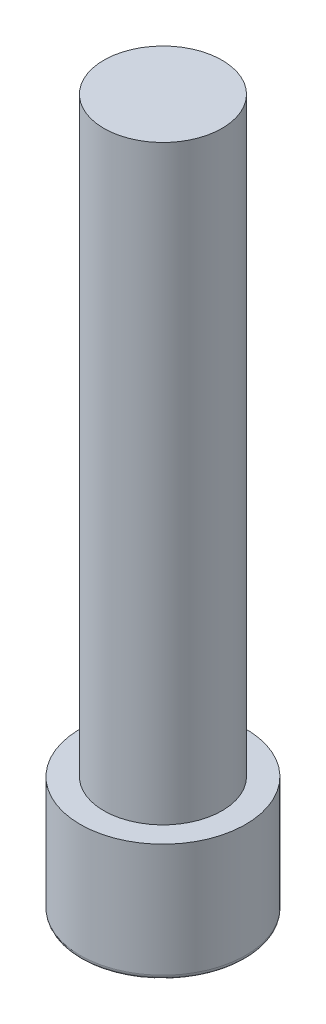
ISO-10303-21;
HEADER;
FILE_DESCRIPTION(('STEP AP214'),'2;1');
FILE_NAME('part.step','',(''),(''),'','','');
FILE_SCHEMA(('AUTOMOTIVE_DESIGN { 1 0 10303 214 1 1 1 1 }'));
ENDSEC;
DATA;
#1=APPLICATION_CONTEXT('core data for automotive mechanical design processes');
#2=APPLICATION_PROTOCOL_DEFINITION('international standard','automotive_design',2000,#1);
#3=PRODUCT_CONTEXT('',#1,'mechanical');
#4=PRODUCT('Part','Part','',(#3));
#5=PRODUCT_RELATED_PRODUCT_CATEGORY('part','',(#4));
#6=PRODUCT_DEFINITION_FORMATION('','',#4);
#7=PRODUCT_DEFINITION_CONTEXT('part definition',#1,'design');
#8=PRODUCT_DEFINITION('design','',#6,#7);
#9=PRODUCT_DEFINITION_SHAPE('','',#8);
#10=(LENGTH_UNIT() NAMED_UNIT(*) SI_UNIT(.MILLI.,.METRE.));
#11=(NAMED_UNIT(*) PLANE_ANGLE_UNIT() SI_UNIT($,.RADIAN.));
#12=(NAMED_UNIT(*) SI_UNIT($,.STERADIAN.) SOLID_ANGLE_UNIT());
#13=UNCERTAINTY_MEASURE_WITH_UNIT(LENGTH_MEASURE(1.E-05),#10,'distance_accuracy_value','');
#14=(GEOMETRIC_REPRESENTATION_CONTEXT(3) GLOBAL_UNCERTAINTY_ASSIGNED_CONTEXT((#13)) GLOBAL_UNIT_ASSIGNED_CONTEXT((#10,
#11,#12)) REPRESENTATION_CONTEXT('',''));
#15=CARTESIAN_POINT('',(0.,0.,0.));
#16=DIRECTION('',(0.,0.,1.));
#17=DIRECTION('',(1.,0.,0.));
#18=AXIS2_PLACEMENT_3D('',#15,#16,#17);
#19=CARTESIAN_POINT('',(0.,5.,0.));
#20=DIRECTION('',(0.,-1.,0.));
#21=DIRECTION('',(0.,0.,-1.));
#22=AXIS2_PLACEMENT_3D('',#19,#20,#21);
#23=CYLINDRICAL_SURFACE('',#22,3.5);
#24=CARTESIAN_POINT('',(0.,0.2,0.));
#25=DIRECTION('',(0.,1.,0.));
#26=DIRECTION('',(0.,0.,1.));
#27=AXIS2_PLACEMENT_3D('',#24,#25,#26);
#28=CIRCLE('',#27,3.5);
#29=CARTESIAN_POINT('',(0.,0.2,3.5));
#30=VERTEX_POINT('',#29);
#31=EDGE_CURVE('E50',#30,#30,#28,.T.);
#32=ORIENTED_EDGE('',*,*,#31,.T.);
#33=EDGE_LOOP('',(#32));
#34=FACE_BOUND('',#33,.T.);
#35=CARTESIAN_POINT('',(0.,5.,0.));
#36=DIRECTION('',(0.,1.,0.));
#37=DIRECTION('',(0.,0.,1.));
#38=AXIS2_PLACEMENT_3D('',#35,#36,#37);
#39=CIRCLE('',#38,3.5);
#40=CARTESIAN_POINT('',(0.,5.,3.5));
#41=VERTEX_POINT('',#40);
#42=EDGE_CURVE('E174',#41,#41,#39,.T.);
#43=ORIENTED_EDGE('',*,*,#42,.F.);
#44=EDGE_LOOP('',(#43));
#45=FACE_BOUND('',#44,.T.);
#46=ADVANCED_FACE('F41',(#34,#45),#23,.T.);
#47=CARTESIAN_POINT('',(0.,5.,0.));
#48=DIRECTION('',(0.,1.,0.));
#49=DIRECTION('',(0.,0.,1.));
#50=AXIS2_PLACEMENT_3D('',#47,#48,#49);
#51=PLANE('',#50);
#52=CARTESIAN_POINT('',(0.,5.,0.));
#53=DIRECTION('',(0.,1.,0.));
#54=DIRECTION('',(0.,0.,1.));
#55=AXIS2_PLACEMENT_3D('',#52,#53,#54);
#56=CIRCLE('',#55,2.5);
#57=CARTESIAN_POINT('',(0.,5.,2.5));
#58=VERTEX_POINT('',#57);
#59=EDGE_CURVE('E175',#58,#58,#56,.T.);
#60=ORIENTED_EDGE('',*,*,#59,.F.);
#61=EDGE_LOOP('',(#60));
#62=FACE_BOUND('',#61,.T.);
#63=ORIENTED_EDGE('',*,*,#42,.T.);
#64=EDGE_LOOP('',(#63));
#65=FACE_BOUND('',#64,.T.);
#66=ADVANCED_FACE('F251',(#62,#65),#51,.T.);
#67=CARTESIAN_POINT('',(0.,0.,0.));
#68=DIRECTION('',(0.,1.,0.));
#69=DIRECTION('',(0.,0.,1.));
#70=AXIS2_PLACEMENT_3D('',#67,#68,#69);
#71=PLANE('',#70);
#72=CARTESIAN_POINT('',(0.,0.,0.));
#73=DIRECTION('',(0.,1.,0.));
#74=DIRECTION('',(0.,0.,1.));
#75=AXIS2_PLACEMENT_3D('',#72,#73,#74);
#76=CIRCLE('',#75,3.3);
#77=CARTESIAN_POINT('',(0.,0.,3.3));
#78=VERTEX_POINT('',#77);
#79=EDGE_CURVE('E11',#78,#78,#76,.F.);
#80=ORIENTED_EDGE('',*,*,#79,.T.);
#81=EDGE_LOOP('',(#80));
#82=FACE_BOUND('',#81,.T.);
#83=DIRECTION('',(0.866025403784439,0.,-0.5));
#84=VECTOR('',#83,1.);
#85=CARTESIAN_POINT('',(0.991025403784441,0.,1.71650635094611));
#86=LINE('',#85,#84);
#87=CARTESIAN_POINT('',(0.,0.,2.28867513459482));
#88=VERTEX_POINT('',#87);
#89=CARTESIAN_POINT('',(1.98205080756888,0.,1.14433756729741));
#90=VERTEX_POINT('',#89);
#91=EDGE_CURVE('E186',#88,#90,#86,.T.);
#92=ORIENTED_EDGE('',*,*,#91,.T.);
#93=DIRECTION('',(0.,0.,-1.));
#94=VECTOR('',#93,1.);
#95=CARTESIAN_POINT('',(1.98205080756888,0.,0.));
#96=LINE('',#95,#94);
#97=CARTESIAN_POINT('',(1.98205080756888,0.,-1.14433756729741));
#98=VERTEX_POINT('',#97);
#99=EDGE_CURVE('E201',#90,#98,#96,.T.);
#100=ORIENTED_EDGE('',*,*,#99,.T.);
#101=DIRECTION('',(-0.866025403784439,0.,-0.5));
#102=VECTOR('',#101,1.);
#103=CARTESIAN_POINT('',(0.991025403784442,0.,-1.71650635094611));
#104=LINE('',#103,#102);
#105=CARTESIAN_POINT('',(0.,0.,-2.28867513459482));
#106=VERTEX_POINT('',#105);
#107=EDGE_CURVE('E198',#98,#106,#104,.T.);
#108=ORIENTED_EDGE('',*,*,#107,.T.);
#109=DIRECTION('',(-0.866025403784439,0.,0.5));
#110=VECTOR('',#109,1.);
#111=CARTESIAN_POINT('',(-0.991025403784442,0.,-1.71650635094611));
#112=LINE('',#111,#110);
#113=CARTESIAN_POINT('',(-1.98205080756888,0.,-1.14433756729741));
#114=VERTEX_POINT('',#113);
#115=EDGE_CURVE('E195',#106,#114,#112,.T.);
#116=ORIENTED_EDGE('',*,*,#115,.T.);
#117=DIRECTION('',(0.,0.,1.));
#118=VECTOR('',#117,1.);
#119=CARTESIAN_POINT('',(-1.98205080756888,0.,0.));
#120=LINE('',#119,#118);
#121=CARTESIAN_POINT('',(-1.98205080756888,0.,1.14433756729741));
#122=VERTEX_POINT('',#121);
#123=EDGE_CURVE('E192',#114,#122,#120,.T.);
#124=ORIENTED_EDGE('',*,*,#123,.T.);
#125=DIRECTION('',(0.866025403784439,0.,0.5));
#126=VECTOR('',#125,1.);
#127=CARTESIAN_POINT('',(-0.991025403784441,0.,1.71650635094611));
#128=LINE('',#127,#126);
#129=EDGE_CURVE('E189',#122,#88,#128,.T.);
#130=ORIENTED_EDGE('',*,*,#129,.T.);
#131=EDGE_LOOP('',(#92,#100,#108,#116,#124,#130));
#132=FACE_BOUND('',#131,.T.);
#133=ADVANCED_FACE('F256',(#82,#132),#71,.F.);
#134=CARTESIAN_POINT('',(0.,30.,0.));
#135=DIRECTION('',(0.,-1.,0.));
#136=DIRECTION('',(0.,0.,-1.));
#137=AXIS2_PLACEMENT_3D('',#134,#135,#136);
#138=CYLINDRICAL_SURFACE('',#137,2.5);
#139=CARTESIAN_POINT('',(0.,30.,0.));
#140=DIRECTION('',(0.,1.,0.));
#141=DIRECTION('',(0.,0.,1.));
#142=AXIS2_PLACEMENT_3D('',#139,#140,#141);
#143=CIRCLE('',#142,2.5);
#144=CARTESIAN_POINT('',(0.,30.,2.5));
#145=VERTEX_POINT('',#144);
#146=EDGE_CURVE('E156',#145,#145,#143,.T.);
#147=ORIENTED_EDGE('',*,*,#146,.F.);
#148=EDGE_LOOP('',(#147));
#149=FACE_BOUND('',#148,.T.);
#150=ORIENTED_EDGE('',*,*,#59,.T.);
#151=EDGE_LOOP('',(#150));
#152=FACE_BOUND('',#151,.T.);
#153=ADVANCED_FACE('F344',(#149,#152),#138,.T.);
#154=CARTESIAN_POINT('',(0.,30.,0.));
#155=DIRECTION('',(0.,1.,0.));
#156=DIRECTION('',(0.,0.,1.));
#157=AXIS2_PLACEMENT_3D('',#154,#155,#156);
#158=PLANE('',#157);
#159=ORIENTED_EDGE('',*,*,#146,.T.);
#160=EDGE_LOOP('',(#159));
#161=FACE_BOUND('',#160,.T.);
#162=ADVANCED_FACE('F330',(#161),#158,.T.);
#163=CARTESIAN_POINT('',(1.73205080756888,2.,1.));
#164=DIRECTION('',(0.5,0.,0.866025403784439));
#165=DIRECTION('',(0.866025403784439,0.,-0.5));
#166=AXIS2_PLACEMENT_3D('',#163,#164,#165);
#167=PLANE('',#166);
#168=DIRECTION('',(0.,-1.,0.));
#169=VECTOR('',#168,1.);
#170=CARTESIAN_POINT('',(1.73205080756888,2.,1.));
#171=LINE('',#170,#169);
#172=CARTESIAN_POINT('',(1.73205080756888,2.,1.));
#173=VERTEX_POINT('',#172);
#174=CARTESIAN_POINT('',(1.73205080756888,0.250000000000004,1.));
#175=VERTEX_POINT('',#174);
#176=EDGE_CURVE('E153',#173,#175,#171,.T.);
#177=ORIENTED_EDGE('',*,*,#176,.T.);
#178=DIRECTION('',(-0.866025403784439,0.,0.5));
#179=VECTOR('',#178,1.);
#180=CARTESIAN_POINT('',(1.73205080756888,0.250000000000004,1.));
#181=LINE('',#180,#179);
#182=CARTESIAN_POINT('',(0.,0.250000000000004,2.));
#183=VERTEX_POINT('',#182);
#184=EDGE_CURVE('E57',#175,#183,#181,.T.);
#185=ORIENTED_EDGE('',*,*,#184,.T.);
#186=DIRECTION('',(0.,-1.,0.));
#187=VECTOR('',#186,1.);
#188=CARTESIAN_POINT('',(0.,2.,2.));
#189=LINE('',#188,#187);
#190=CARTESIAN_POINT('',(0.,2.,2.));
#191=VERTEX_POINT('',#190);
#192=EDGE_CURVE('E112',#191,#183,#189,.T.);
#193=ORIENTED_EDGE('',*,*,#192,.F.);
#194=DIRECTION('',(-0.866025403784439,0.,0.5));
#195=VECTOR('',#194,1.);
#196=CARTESIAN_POINT('',(1.73205080756888,2.,1.));
#197=LINE('',#196,#195);
#198=EDGE_CURVE('E116',#173,#191,#197,.T.);
#199=ORIENTED_EDGE('',*,*,#198,.F.);
#200=EDGE_LOOP('',(#177,#185,#193,#199));
#201=FACE_BOUND('',#200,.T.);
#202=ADVANCED_FACE('F114',(#201),#167,.F.);
#203=CARTESIAN_POINT('',(1.73205080756888,2.,-1.));
#204=DIRECTION('',(1.,0.,0.));
#205=DIRECTION('',(0.,0.,-1.));
#206=AXIS2_PLACEMENT_3D('',#203,#204,#205);
#207=PLANE('',#206);
#208=DIRECTION('',(0.,-1.,0.));
#209=VECTOR('',#208,1.);
#210=CARTESIAN_POINT('',(1.73205080756888,2.,-1.));
#211=LINE('',#210,#209);
#212=CARTESIAN_POINT('',(1.73205080756888,2.,-1.));
#213=VERTEX_POINT('',#212);
#214=CARTESIAN_POINT('',(1.73205080756888,0.250000000000004,-1.));
#215=VERTEX_POINT('',#214);
#216=EDGE_CURVE('E157',#213,#215,#211,.T.);
#217=ORIENTED_EDGE('',*,*,#216,.T.);
#218=DIRECTION('',(0.,0.,1.));
#219=VECTOR('',#218,1.);
#220=CARTESIAN_POINT('',(1.73205080756888,0.250000000000004,-1.));
#221=LINE('',#220,#219);
#222=EDGE_CURVE('E179',#215,#175,#221,.T.);
#223=ORIENTED_EDGE('',*,*,#222,.T.);
#224=ORIENTED_EDGE('',*,*,#176,.F.);
#225=DIRECTION('',(0.,0.,1.));
#226=VECTOR('',#225,1.);
#227=CARTESIAN_POINT('',(1.73205080756888,2.,-1.));
#228=LINE('',#227,#226);
#229=EDGE_CURVE('E120',#213,#173,#228,.T.);
#230=ORIENTED_EDGE('',*,*,#229,.F.);
#231=EDGE_LOOP('',(#217,#223,#224,#230));
#232=FACE_BOUND('',#231,.T.);
#233=ADVANCED_FACE('F320',(#232),#207,.F.);
#234=CARTESIAN_POINT('',(0.,2.,-2.));
#235=DIRECTION('',(0.5,0.,-0.866025403784439));
#236=DIRECTION('',(-0.866025403784439,0.,-0.5));
#237=AXIS2_PLACEMENT_3D('',#234,#235,#236);
#238=PLANE('',#237);
#239=DIRECTION('',(0.,-1.,0.));
#240=VECTOR('',#239,1.);
#241=CARTESIAN_POINT('',(0.,2.,-2.));
#242=LINE('',#241,#240);
#243=CARTESIAN_POINT('',(0.,2.,-2.));
#244=VERTEX_POINT('',#243);
#245=CARTESIAN_POINT('',(0.,0.250000000000004,-2.));
#246=VERTEX_POINT('',#245);
#247=EDGE_CURVE('E161',#244,#246,#242,.T.);
#248=ORIENTED_EDGE('',*,*,#247,.T.);
#249=DIRECTION('',(0.866025403784439,0.,0.5));
#250=VECTOR('',#249,1.);
#251=CARTESIAN_POINT('',(0.,0.250000000000004,-2.));
#252=LINE('',#251,#250);
#253=EDGE_CURVE('E205',#246,#215,#252,.T.);
#254=ORIENTED_EDGE('',*,*,#253,.T.);
#255=ORIENTED_EDGE('',*,*,#216,.F.);
#256=DIRECTION('',(0.866025403784439,0.,0.5));
#257=VECTOR('',#256,1.);
#258=CARTESIAN_POINT('',(0.,2.,-2.));
#259=LINE('',#258,#257);
#260=EDGE_CURVE('E148',#244,#213,#259,.T.);
#261=ORIENTED_EDGE('',*,*,#260,.F.);
#262=EDGE_LOOP('',(#248,#254,#255,#261));
#263=FACE_BOUND('',#262,.T.);
#264=ADVANCED_FACE('F317',(#263),#238,.F.);
#265=CARTESIAN_POINT('',(-1.73205080756888,2.,-1.));
#266=DIRECTION('',(-0.5,0.,-0.866025403784439));
#267=DIRECTION('',(-0.866025403784439,0.,0.5));
#268=AXIS2_PLACEMENT_3D('',#265,#266,#267);
#269=PLANE('',#268);
#270=DIRECTION('',(0.,-1.,0.));
#271=VECTOR('',#270,1.);
#272=CARTESIAN_POINT('',(-1.73205080756888,2.,-1.));
#273=LINE('',#272,#271);
#274=CARTESIAN_POINT('',(-1.73205080756888,2.,-1.));
#275=VERTEX_POINT('',#274);
#276=CARTESIAN_POINT('',(-1.73205080756888,0.250000000000004,-1.));
#277=VERTEX_POINT('',#276);
#278=EDGE_CURVE('E165',#275,#277,#273,.T.);
#279=ORIENTED_EDGE('',*,*,#278,.T.);
#280=DIRECTION('',(0.866025403784439,0.,-0.5));
#281=VECTOR('',#280,1.);
#282=CARTESIAN_POINT('',(-1.73205080756888,0.250000000000004,-1.));
#283=LINE('',#282,#281);
#284=EDGE_CURVE('E208',#277,#246,#283,.T.);
#285=ORIENTED_EDGE('',*,*,#284,.T.);
#286=ORIENTED_EDGE('',*,*,#247,.F.);
#287=DIRECTION('',(0.866025403784439,0.,-0.5));
#288=VECTOR('',#287,1.);
#289=CARTESIAN_POINT('',(-1.73205080756888,2.,-1.));
#290=LINE('',#289,#288);
#291=EDGE_CURVE('E144',#275,#244,#290,.T.);
#292=ORIENTED_EDGE('',*,*,#291,.F.);
#293=EDGE_LOOP('',(#279,#285,#286,#292));
#294=FACE_BOUND('',#293,.T.);
#295=ADVANCED_FACE('F328',(#294),#269,.F.);
#296=CARTESIAN_POINT('',(-1.73205080756888,2.,1.));
#297=DIRECTION('',(-1.,0.,0.));
#298=DIRECTION('',(0.,0.,1.));
#299=AXIS2_PLACEMENT_3D('',#296,#297,#298);
#300=PLANE('',#299);
#301=DIRECTION('',(0.,-1.,0.));
#302=VECTOR('',#301,1.);
#303=CARTESIAN_POINT('',(-1.73205080756888,2.,1.));
#304=LINE('',#303,#302);
#305=CARTESIAN_POINT('',(-1.73205080756888,2.,1.));
#306=VERTEX_POINT('',#305);
#307=CARTESIAN_POINT('',(-1.73205080756888,0.250000000000004,1.));
#308=VERTEX_POINT('',#307);
#309=EDGE_CURVE('E119',#306,#308,#304,.T.);
#310=ORIENTED_EDGE('',*,*,#309,.T.);
#311=DIRECTION('',(0.,0.,-1.));
#312=VECTOR('',#311,1.);
#313=CARTESIAN_POINT('',(-1.73205080756888,0.250000000000004,1.));
#314=LINE('',#313,#312);
#315=EDGE_CURVE('E211',#308,#277,#314,.T.);
#316=ORIENTED_EDGE('',*,*,#315,.T.);
#317=ORIENTED_EDGE('',*,*,#278,.F.);
#318=DIRECTION('',(0.,0.,-1.));
#319=VECTOR('',#318,1.);
#320=CARTESIAN_POINT('',(-1.73205080756888,2.,1.));
#321=LINE('',#320,#319);
#322=EDGE_CURVE('E129',#306,#275,#321,.T.);
#323=ORIENTED_EDGE('',*,*,#322,.F.);
#324=EDGE_LOOP('',(#310,#316,#317,#323));
#325=FACE_BOUND('',#324,.T.);
#326=ADVANCED_FACE('F335',(#325),#300,.F.);
#327=CARTESIAN_POINT('',(0.,2.,2.));
#328=DIRECTION('',(-0.5,0.,0.866025403784439));
#329=DIRECTION('',(0.866025403784439,0.,0.5));
#330=AXIS2_PLACEMENT_3D('',#327,#328,#329);
#331=PLANE('',#330);
#332=ORIENTED_EDGE('',*,*,#192,.T.);
#333=DIRECTION('',(-0.866025403784439,0.,-0.5));
#334=VECTOR('',#333,1.);
#335=CARTESIAN_POINT('',(0.,0.250000000000004,2.));
#336=LINE('',#335,#334);
#337=EDGE_CURVE('E64',#183,#308,#336,.T.);
#338=ORIENTED_EDGE('',*,*,#337,.T.);
#339=ORIENTED_EDGE('',*,*,#309,.F.);
#340=DIRECTION('',(-0.866025403784439,0.,-0.5));
#341=VECTOR('',#340,1.);
#342=CARTESIAN_POINT('',(0.,2.,2.));
#343=LINE('',#342,#341);
#344=EDGE_CURVE('E123',#191,#306,#343,.T.);
#345=ORIENTED_EDGE('',*,*,#344,.F.);
#346=EDGE_LOOP('',(#332,#338,#339,#345));
#347=FACE_BOUND('',#346,.T.);
#348=ADVANCED_FACE('F124',(#347),#331,.F.);
#349=CARTESIAN_POINT('',(0.,2.,0.));
#350=DIRECTION('',(0.,-1.,0.));
#351=DIRECTION('',(0.,0.,-1.));
#352=AXIS2_PLACEMENT_3D('',#349,#350,#351);
#353=PLANE('',#352);
#354=ORIENTED_EDGE('',*,*,#198,.T.);
#355=ORIENTED_EDGE('',*,*,#344,.T.);
#356=ORIENTED_EDGE('',*,*,#322,.T.);
#357=ORIENTED_EDGE('',*,*,#291,.T.);
#358=ORIENTED_EDGE('',*,*,#260,.T.);
#359=ORIENTED_EDGE('',*,*,#229,.T.);
#360=EDGE_LOOP('',(#354,#355,#356,#357,#358,#359));
#361=FACE_BOUND('',#360,.T.);
#362=ADVANCED_FACE('F131',(#361),#353,.T.);
#363=CARTESIAN_POINT('',(-1.73205080756888,0.250000000000004,1.));
#364=DIRECTION('',(-0.707106781186546,0.707106781186549,0.));
#365=DIRECTION('',(0.,0.,-1.));
#366=AXIS2_PLACEMENT_3D('',#363,#364,#365);
#367=PLANE('',#366);
#368=DIRECTION('',(0.654653670707979,0.654653670707976,-0.377964473009227));
#369=VECTOR('',#368,1.);
#370=CARTESIAN_POINT('',(-1.73205080756888,0.250000000000004,1.));
#371=LINE('',#370,#369);
#372=EDGE_CURVE('E139',#122,#308,#371,.T.);
#373=ORIENTED_EDGE('',*,*,#372,.F.);
#374=ORIENTED_EDGE('',*,*,#123,.F.);
#375=DIRECTION('',(0.654653670707978,0.654653670707975,0.377964473009229));
#376=VECTOR('',#375,1.);
#377=CARTESIAN_POINT('',(-1.73205080756888,0.250000000000004,-1.));
#378=LINE('',#377,#376);
#379=EDGE_CURVE('E135',#277,#114,#378,.F.);
#380=ORIENTED_EDGE('',*,*,#379,.F.);
#381=ORIENTED_EDGE('',*,*,#315,.F.);
#382=EDGE_LOOP('',(#373,#374,#380,#381));
#383=FACE_BOUND('',#382,.T.);
#384=ADVANCED_FACE('F290',(#383),#367,.F.);
#385=CARTESIAN_POINT('',(-1.73205080756888,0.250000000000004,-1.));
#386=DIRECTION('',(-0.353553390593273,0.70710678118655,-0.612372435695793));
#387=DIRECTION('',(0.866025403784439,0.,-0.5));
#388=AXIS2_PLACEMENT_3D('',#385,#386,#387);
#389=PLANE('',#388);
#390=ORIENTED_EDGE('',*,*,#379,.T.);
#391=ORIENTED_EDGE('',*,*,#115,.F.);
#392=DIRECTION('',(0.,0.654653670707975,0.755928946018456));
#393=VECTOR('',#392,1.);
#394=CARTESIAN_POINT('',(0.,0.250000000000004,-2.));
#395=LINE('',#394,#393);
#396=EDGE_CURVE('E228',#246,#106,#395,.F.);
#397=ORIENTED_EDGE('',*,*,#396,.F.);
#398=ORIENTED_EDGE('',*,*,#284,.F.);
#399=EDGE_LOOP('',(#390,#391,#397,#398));
#400=FACE_BOUND('',#399,.T.);
#401=ADVANCED_FACE('F284',(#400),#389,.F.);
#402=CARTESIAN_POINT('',(0.,0.250000000000004,2.));
#403=DIRECTION('',(-0.353553390593273,0.707106781186549,0.612372435695794));
#404=DIRECTION('',(-0.866025403784439,0.,-0.5));
#405=AXIS2_PLACEMENT_3D('',#402,#403,#404);
#406=PLANE('',#405);
#407=ORIENTED_EDGE('',*,*,#372,.T.);
#408=ORIENTED_EDGE('',*,*,#337,.F.);
#409=DIRECTION('',(0.,0.654653670707976,-0.755928946018456));
#410=VECTOR('',#409,1.);
#411=CARTESIAN_POINT('',(0.,0.250000000000004,2.));
#412=LINE('',#411,#410);
#413=EDGE_CURVE('E224',#88,#183,#412,.T.);
#414=ORIENTED_EDGE('',*,*,#413,.F.);
#415=ORIENTED_EDGE('',*,*,#129,.F.);
#416=EDGE_LOOP('',(#407,#408,#414,#415));
#417=FACE_BOUND('',#416,.T.);
#418=ADVANCED_FACE('F277',(#417),#406,.F.);
#419=CARTESIAN_POINT('',(0.,0.250000000000004,-2.));
#420=DIRECTION('',(0.353553390593273,0.707106781186549,-0.612372435695793));
#421=DIRECTION('',(0.866025403784439,0.,0.5));
#422=AXIS2_PLACEMENT_3D('',#419,#420,#421);
#423=PLANE('',#422);
#424=ORIENTED_EDGE('',*,*,#396,.T.);
#425=ORIENTED_EDGE('',*,*,#107,.F.);
#426=DIRECTION('',(-0.654653670707979,0.654653670707975,0.377964473009227));
#427=VECTOR('',#426,1.);
#428=CARTESIAN_POINT('',(1.73205080756888,0.250000000000004,-1.));
#429=LINE('',#428,#427);
#430=EDGE_CURVE('E221',#215,#98,#429,.F.);
#431=ORIENTED_EDGE('',*,*,#430,.F.);
#432=ORIENTED_EDGE('',*,*,#253,.F.);
#433=EDGE_LOOP('',(#424,#425,#431,#432));
#434=FACE_BOUND('',#433,.T.);
#435=ADVANCED_FACE('F270',(#434),#423,.F.);
#436=CARTESIAN_POINT('',(1.73205080756888,0.250000000000004,1.));
#437=DIRECTION('',(0.353553390593273,0.707106781186549,0.612372435695793));
#438=DIRECTION('',(-0.866025403784439,0.,0.5));
#439=AXIS2_PLACEMENT_3D('',#436,#437,#438);
#440=PLANE('',#439);
#441=ORIENTED_EDGE('',*,*,#413,.T.);
#442=ORIENTED_EDGE('',*,*,#184,.F.);
#443=DIRECTION('',(0.654653670707979,-0.654653670707975,0.377964473009228));
#444=VECTOR('',#443,1.);
#445=CARTESIAN_POINT('',(1.23717914826348,0.744871659305397,0.714285714285715));
#446=LINE('',#445,#444);
#447=EDGE_CURVE('E218',#90,#175,#446,.F.);
#448=ORIENTED_EDGE('',*,*,#447,.F.);
#449=ORIENTED_EDGE('',*,*,#91,.F.);
#450=EDGE_LOOP('',(#441,#442,#448,#449));
#451=FACE_BOUND('',#450,.T.);
#452=ADVANCED_FACE('F246',(#451),#440,.F.);
#453=CARTESIAN_POINT('',(1.73205080756888,0.250000000000004,-1.));
#454=DIRECTION('',(0.707106781186546,0.707106781186549,0.));
#455=DIRECTION('',(0.,0.,1.));
#456=AXIS2_PLACEMENT_3D('',#453,#454,#455);
#457=PLANE('',#456);
#458=ORIENTED_EDGE('',*,*,#430,.T.);
#459=ORIENTED_EDGE('',*,*,#99,.F.);
#460=ORIENTED_EDGE('',*,*,#447,.T.);
#461=ORIENTED_EDGE('',*,*,#222,.F.);
#462=EDGE_LOOP('',(#458,#459,#460,#461));
#463=FACE_BOUND('',#462,.T.);
#464=ADVANCED_FACE('F241',(#463),#457,.F.);
#465=CARTESIAN_POINT('',(0.,0.2,0.));
#466=DIRECTION('',(0.,1.,0.));
#467=DIRECTION('',(0.,0.,1.));
#468=AXIS2_PLACEMENT_3D('',#465,#466,#467);
#469=TOROIDAL_SURFACE('',#468,3.3,0.2);
#470=ORIENTED_EDGE('',*,*,#79,.F.);
#471=EDGE_LOOP('',(#470));
#472=FACE_BOUND('',#471,.T.);
#473=ORIENTED_EDGE('',*,*,#31,.F.);
#474=EDGE_LOOP('',(#473));
#475=FACE_BOUND('',#474,.T.);
#476=ADVANCED_FACE('F43',(#472,#475),#469,.T.);
#477=CLOSED_SHELL('',(#46,#66,#133,#153,#162,#202,#233,#264,#295,#326,#348,#362,#384,#401,#418,
#435,#452,#464,#476));
#478=MANIFOLD_SOLID_BREP('B2',#477);
#479=ADVANCED_BREP_SHAPE_REPRESENTATION('',(#18,#478),#14);
#480=SHAPE_DEFINITION_REPRESENTATION(#9,#479);
ENDSEC;
END-ISO-10303-21;
